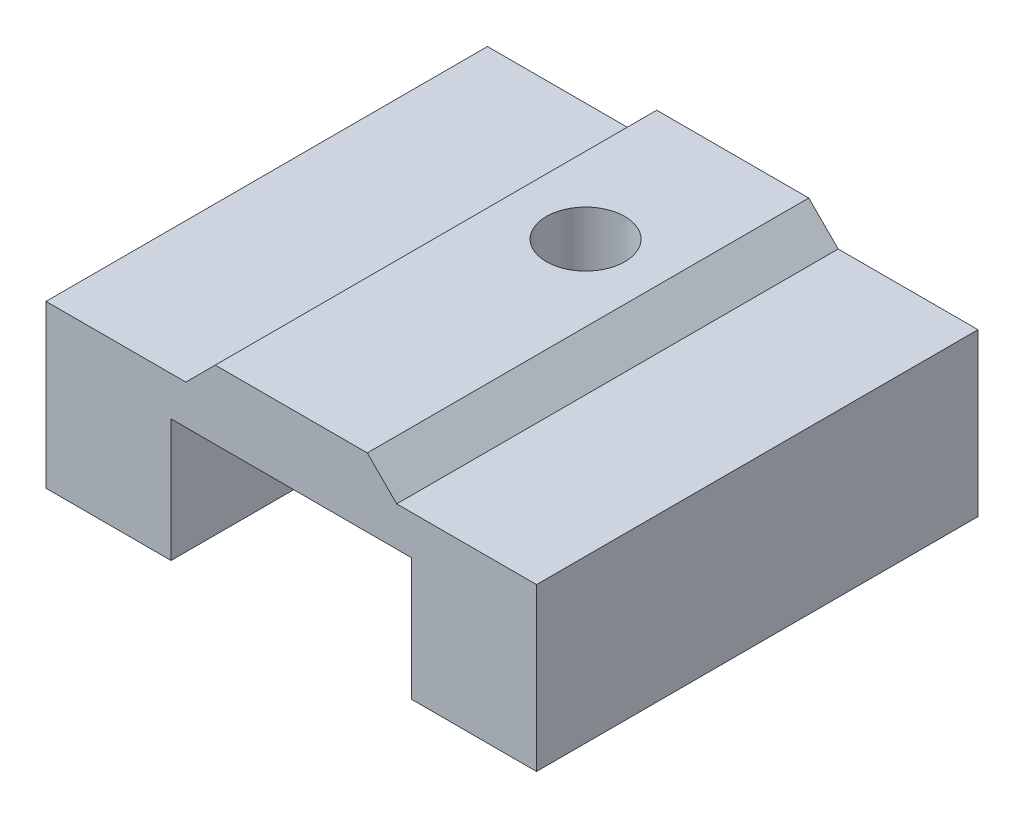
ISO-10303-21;
HEADER;
FILE_DESCRIPTION(('STEP AP214'),'2;1');
FILE_NAME('part.step','',(''),(''),'','','');
FILE_SCHEMA(('AUTOMOTIVE_DESIGN { 1 0 10303 214 1 1 1 1 }'));
ENDSEC;
DATA;
#1=APPLICATION_CONTEXT('core data for automotive mechanical design processes');
#2=APPLICATION_PROTOCOL_DEFINITION('international standard','automotive_design',2000,#1);
#3=PRODUCT_CONTEXT('',#1,'mechanical');
#4=PRODUCT('Part','Part','',(#3));
#5=PRODUCT_RELATED_PRODUCT_CATEGORY('part','',(#4));
#6=PRODUCT_DEFINITION_FORMATION('','',#4);
#7=PRODUCT_DEFINITION_CONTEXT('part definition',#1,'design');
#8=PRODUCT_DEFINITION('design','',#6,#7);
#9=PRODUCT_DEFINITION_SHAPE('','',#8);
#10=(LENGTH_UNIT() NAMED_UNIT(*) SI_UNIT(.MILLI.,.METRE.));
#11=(NAMED_UNIT(*) PLANE_ANGLE_UNIT() SI_UNIT($,.RADIAN.));
#12=(NAMED_UNIT(*) SI_UNIT($,.STERADIAN.) SOLID_ANGLE_UNIT());
#13=UNCERTAINTY_MEASURE_WITH_UNIT(LENGTH_MEASURE(1.E-05),#10,'distance_accuracy_value','');
#14=(GEOMETRIC_REPRESENTATION_CONTEXT(3) GLOBAL_UNCERTAINTY_ASSIGNED_CONTEXT((#13)) GLOBAL_UNIT_ASSIGNED_CONTEXT((#10,
#11,#12)) REPRESENTATION_CONTEXT('',''));
#15=CARTESIAN_POINT('',(0.,0.,0.));
#16=DIRECTION('',(0.,0.,1.));
#17=DIRECTION('',(1.,0.,0.));
#18=AXIS2_PLACEMENT_3D('',#15,#16,#17);
#19=CARTESIAN_POINT('',(-10.,-1.2,18.));
#20=DIRECTION('',(0.,-1.,0.));
#21=DIRECTION('',(0.,0.,-1.));
#22=AXIS2_PLACEMENT_3D('',#19,#20,#21);
#23=PLANE('',#22);
#24=DIRECTION('',(-1.,0.,0.));
#25=VECTOR('',#24,1.);
#26=CARTESIAN_POINT('',(-10.,-1.2,18.));
#27=LINE('',#26,#25);
#28=CARTESIAN_POINT('',(-4.30000000000001,-1.2,18.));
#29=VERTEX_POINT('',#28);
#30=CARTESIAN_POINT('',(-10.,-1.2,18.));
#31=VERTEX_POINT('',#30);
#32=EDGE_CURVE('E120',#29,#31,#27,.T.);
#33=ORIENTED_EDGE('',*,*,#32,.F.);
#34=DIRECTION('',(0.,0.,-1.));
#35=VECTOR('',#34,1.);
#36=CARTESIAN_POINT('',(-4.30000000000001,-1.2,0.));
#37=LINE('',#36,#35);
#38=CARTESIAN_POINT('',(-4.30000000000001,-1.2,0.));
#39=VERTEX_POINT('',#38);
#40=EDGE_CURVE('E207',#29,#39,#37,.T.);
#41=ORIENTED_EDGE('',*,*,#40,.T.);
#42=DIRECTION('',(-1.,0.,0.));
#43=VECTOR('',#42,1.);
#44=CARTESIAN_POINT('',(-10.,-1.2,0.));
#45=LINE('',#44,#43);
#46=CARTESIAN_POINT('',(-10.,-1.2,0.));
#47=VERTEX_POINT('',#46);
#48=EDGE_CURVE('E132',#39,#47,#45,.T.);
#49=ORIENTED_EDGE('',*,*,#48,.T.);
#50=DIRECTION('',(0.,0.,-1.));
#51=VECTOR('',#50,1.);
#52=CARTESIAN_POINT('',(-10.,-1.2,18.));
#53=LINE('',#52,#51);
#54=EDGE_CURVE('E130',#31,#47,#53,.T.);
#55=ORIENTED_EDGE('',*,*,#54,.F.);
#56=EDGE_LOOP('',(#33,#41,#49,#55));
#57=FACE_BOUND('',#56,.T.);
#58=ADVANCED_FACE('F35',(#57),#23,.F.);
#59=CARTESIAN_POINT('',(-10.,-7.8,18.));
#60=DIRECTION('',(1.,0.,0.));
#61=DIRECTION('',(0.,1.,0.));
#62=AXIS2_PLACEMENT_3D('',#59,#60,#61);
#63=PLANE('',#62);
#64=DIRECTION('',(0.,-1.,0.));
#65=VECTOR('',#64,1.);
#66=CARTESIAN_POINT('',(-10.,-7.8,0.));
#67=LINE('',#66,#65);
#68=CARTESIAN_POINT('',(-10.,-7.8,0.));
#69=VERTEX_POINT('',#68);
#70=EDGE_CURVE('E163',#47,#69,#67,.T.);
#71=ORIENTED_EDGE('',*,*,#70,.T.);
#72=DIRECTION('',(0.,0.,-1.));
#73=VECTOR('',#72,1.);
#74=CARTESIAN_POINT('',(-10.,-7.8,18.));
#75=LINE('',#74,#73);
#76=CARTESIAN_POINT('',(-10.,-7.8,18.));
#77=VERTEX_POINT('',#76);
#78=EDGE_CURVE('E136',#77,#69,#75,.T.);
#79=ORIENTED_EDGE('',*,*,#78,.F.);
#80=DIRECTION('',(0.,-1.,0.));
#81=VECTOR('',#80,1.);
#82=CARTESIAN_POINT('',(-10.,-7.8,18.));
#83=LINE('',#82,#81);
#84=EDGE_CURVE('E124',#31,#77,#83,.T.);
#85=ORIENTED_EDGE('',*,*,#84,.F.);
#86=ORIENTED_EDGE('',*,*,#54,.T.);
#87=EDGE_LOOP('',(#71,#79,#85,#86));
#88=FACE_BOUND('',#87,.T.);
#89=ADVANCED_FACE('F138',(#88),#63,.F.);
#90=CARTESIAN_POINT('',(-4.9,-7.8,18.));
#91=DIRECTION('',(0.,1.,0.));
#92=DIRECTION('',(0.,0.,1.));
#93=AXIS2_PLACEMENT_3D('',#90,#91,#92);
#94=PLANE('',#93);
#95=DIRECTION('',(1.,0.,0.));
#96=VECTOR('',#95,1.);
#97=CARTESIAN_POINT('',(-4.9,-7.8,0.));
#98=LINE('',#97,#96);
#99=CARTESIAN_POINT('',(-4.9,-7.8,0.));
#100=VERTEX_POINT('',#99);
#101=EDGE_CURVE('E166',#69,#100,#98,.T.);
#102=ORIENTED_EDGE('',*,*,#101,.T.);
#103=DIRECTION('',(0.,0.,-1.));
#104=VECTOR('',#103,1.);
#105=CARTESIAN_POINT('',(-4.9,-7.8,18.));
#106=LINE('',#105,#104);
#107=CARTESIAN_POINT('',(-4.9,-7.8,18.));
#108=VERTEX_POINT('',#107);
#109=EDGE_CURVE('E202',#108,#100,#106,.T.);
#110=ORIENTED_EDGE('',*,*,#109,.F.);
#111=DIRECTION('',(1.,0.,0.));
#112=VECTOR('',#111,1.);
#113=CARTESIAN_POINT('',(-4.9,-7.8,18.));
#114=LINE('',#113,#112);
#115=EDGE_CURVE('E141',#77,#108,#114,.T.);
#116=ORIENTED_EDGE('',*,*,#115,.F.);
#117=ORIENTED_EDGE('',*,*,#78,.T.);
#118=EDGE_LOOP('',(#102,#110,#116,#117));
#119=FACE_BOUND('',#118,.T.);
#120=ADVANCED_FACE('F232',(#119),#94,.F.);
#121=CARTESIAN_POINT('',(-4.9,-2.8,18.));
#122=DIRECTION('',(-1.,0.,0.));
#123=DIRECTION('',(0.,0.,1.));
#124=AXIS2_PLACEMENT_3D('',#121,#122,#123);
#125=PLANE('',#124);
#126=DIRECTION('',(0.,1.,0.));
#127=VECTOR('',#126,1.);
#128=CARTESIAN_POINT('',(-4.9,-2.8,0.));
#129=LINE('',#128,#127);
#130=CARTESIAN_POINT('',(-4.9,-2.8,0.));
#131=VERTEX_POINT('',#130);
#132=EDGE_CURVE('E168',#100,#131,#129,.T.);
#133=ORIENTED_EDGE('',*,*,#132,.T.);
#134=DIRECTION('',(0.,0.,-1.));
#135=VECTOR('',#134,1.);
#136=CARTESIAN_POINT('',(-4.9,-2.8,18.));
#137=LINE('',#136,#135);
#138=CARTESIAN_POINT('',(-4.9,-2.8,18.));
#139=VERTEX_POINT('',#138);
#140=EDGE_CURVE('E199',#139,#131,#137,.T.);
#141=ORIENTED_EDGE('',*,*,#140,.F.);
#142=DIRECTION('',(0.,1.,0.));
#143=VECTOR('',#142,1.);
#144=CARTESIAN_POINT('',(-4.9,-2.8,18.));
#145=LINE('',#144,#143);
#146=EDGE_CURVE('E143',#108,#139,#145,.T.);
#147=ORIENTED_EDGE('',*,*,#146,.F.);
#148=ORIENTED_EDGE('',*,*,#109,.T.);
#149=EDGE_LOOP('',(#133,#141,#147,#148));
#150=FACE_BOUND('',#149,.T.);
#151=ADVANCED_FACE('F242',(#150),#125,.F.);
#152=CARTESIAN_POINT('',(4.9,-2.8,18.));
#153=DIRECTION('',(0.,1.,0.));
#154=DIRECTION('',(0.,0.,1.));
#155=AXIS2_PLACEMENT_3D('',#152,#153,#154);
#156=PLANE('',#155);
#157=CARTESIAN_POINT('',(0.,-2.8,6.));
#158=DIRECTION('',(0.,1.,0.));
#159=DIRECTION('',(0.,0.,1.));
#160=AXIS2_PLACEMENT_3D('',#157,#158,#159);
#161=CIRCLE('',#160,1.6);
#162=CARTESIAN_POINT('',(0.,-2.8,7.6));
#163=VERTEX_POINT('',#162);
#164=EDGE_CURVE('E164',#163,#163,#161,.T.);
#165=ORIENTED_EDGE('',*,*,#164,.T.);
#166=EDGE_LOOP('',(#165));
#167=FACE_BOUND('',#166,.T.);
#168=DIRECTION('',(1.,0.,0.));
#169=VECTOR('',#168,1.);
#170=CARTESIAN_POINT('',(4.9,-2.8,0.));
#171=LINE('',#170,#169);
#172=CARTESIAN_POINT('',(4.9,-2.8,0.));
#173=VERTEX_POINT('',#172);
#174=EDGE_CURVE('E170',#131,#173,#171,.T.);
#175=ORIENTED_EDGE('',*,*,#174,.T.);
#176=DIRECTION('',(0.,0.,-1.));
#177=VECTOR('',#176,1.);
#178=CARTESIAN_POINT('',(4.9,-2.8,18.));
#179=LINE('',#178,#177);
#180=CARTESIAN_POINT('',(4.9,-2.8,18.));
#181=VERTEX_POINT('',#180);
#182=EDGE_CURVE('E196',#181,#173,#179,.T.);
#183=ORIENTED_EDGE('',*,*,#182,.F.);
#184=DIRECTION('',(1.,0.,0.));
#185=VECTOR('',#184,1.);
#186=CARTESIAN_POINT('',(4.9,-2.8,18.));
#187=LINE('',#186,#185);
#188=EDGE_CURVE('E148',#139,#181,#187,.T.);
#189=ORIENTED_EDGE('',*,*,#188,.F.);
#190=ORIENTED_EDGE('',*,*,#140,.T.);
#191=EDGE_LOOP('',(#175,#183,#189,#190));
#192=FACE_BOUND('',#191,.T.);
#193=ADVANCED_FACE('F246',(#167,#192),#156,.F.);
#194=CARTESIAN_POINT('',(4.9,-7.8,18.));
#195=DIRECTION('',(1.,0.,0.));
#196=DIRECTION('',(0.,0.,-1.));
#197=AXIS2_PLACEMENT_3D('',#194,#195,#196);
#198=PLANE('',#197);
#199=DIRECTION('',(0.,-1.,0.));
#200=VECTOR('',#199,1.);
#201=CARTESIAN_POINT('',(4.9,-7.8,0.));
#202=LINE('',#201,#200);
#203=CARTESIAN_POINT('',(4.9,-7.8,0.));
#204=VERTEX_POINT('',#203);
#205=EDGE_CURVE('E172',#173,#204,#202,.T.);
#206=ORIENTED_EDGE('',*,*,#205,.T.);
#207=DIRECTION('',(0.,0.,-1.));
#208=VECTOR('',#207,1.);
#209=CARTESIAN_POINT('',(4.9,-7.8,18.));
#210=LINE('',#209,#208);
#211=CARTESIAN_POINT('',(4.9,-7.8,18.));
#212=VERTEX_POINT('',#211);
#213=EDGE_CURVE('E193',#212,#204,#210,.T.);
#214=ORIENTED_EDGE('',*,*,#213,.F.);
#215=DIRECTION('',(0.,-1.,0.));
#216=VECTOR('',#215,1.);
#217=CARTESIAN_POINT('',(4.9,-7.8,18.));
#218=LINE('',#217,#216);
#219=EDGE_CURVE('E150',#181,#212,#218,.T.);
#220=ORIENTED_EDGE('',*,*,#219,.F.);
#221=ORIENTED_EDGE('',*,*,#182,.T.);
#222=EDGE_LOOP('',(#206,#214,#220,#221));
#223=FACE_BOUND('',#222,.T.);
#224=ADVANCED_FACE('F250',(#223),#198,.F.);
#225=CARTESIAN_POINT('',(10.,-7.8,18.));
#226=DIRECTION('',(0.,1.,0.));
#227=DIRECTION('',(0.,0.,1.));
#228=AXIS2_PLACEMENT_3D('',#225,#226,#227);
#229=PLANE('',#228);
#230=DIRECTION('',(1.,0.,0.));
#231=VECTOR('',#230,1.);
#232=CARTESIAN_POINT('',(10.,-7.8,0.));
#233=LINE('',#232,#231);
#234=CARTESIAN_POINT('',(10.,-7.8,0.));
#235=VERTEX_POINT('',#234);
#236=EDGE_CURVE('E174',#204,#235,#233,.T.);
#237=ORIENTED_EDGE('',*,*,#236,.T.);
#238=DIRECTION('',(0.,0.,-1.));
#239=VECTOR('',#238,1.);
#240=CARTESIAN_POINT('',(10.,-7.8,18.));
#241=LINE('',#240,#239);
#242=CARTESIAN_POINT('',(10.,-7.8,18.));
#243=VERTEX_POINT('',#242);
#244=EDGE_CURVE('E190',#243,#235,#241,.T.);
#245=ORIENTED_EDGE('',*,*,#244,.F.);
#246=DIRECTION('',(1.,0.,0.));
#247=VECTOR('',#246,1.);
#248=CARTESIAN_POINT('',(10.,-7.8,18.));
#249=LINE('',#248,#247);
#250=EDGE_CURVE('E152',#212,#243,#249,.T.);
#251=ORIENTED_EDGE('',*,*,#250,.F.);
#252=ORIENTED_EDGE('',*,*,#213,.T.);
#253=EDGE_LOOP('',(#237,#245,#251,#252));
#254=FACE_BOUND('',#253,.T.);
#255=ADVANCED_FACE('F254',(#254),#229,.F.);
#256=CARTESIAN_POINT('',(10.,-1.2,18.));
#257=DIRECTION('',(-1.,0.,0.));
#258=DIRECTION('',(0.,-1.,0.));
#259=AXIS2_PLACEMENT_3D('',#256,#257,#258);
#260=PLANE('',#259);
#261=DIRECTION('',(0.,1.,0.));
#262=VECTOR('',#261,1.);
#263=CARTESIAN_POINT('',(10.,-1.2,0.));
#264=LINE('',#263,#262);
#265=CARTESIAN_POINT('',(10.,-1.2,0.));
#266=VERTEX_POINT('',#265);
#267=EDGE_CURVE('E176',#235,#266,#264,.T.);
#268=ORIENTED_EDGE('',*,*,#267,.T.);
#269=DIRECTION('',(0.,0.,-1.));
#270=VECTOR('',#269,1.);
#271=CARTESIAN_POINT('',(10.,-1.2,18.));
#272=LINE('',#271,#270);
#273=CARTESIAN_POINT('',(10.,-1.2,18.));
#274=VERTEX_POINT('',#273);
#275=EDGE_CURVE('E187',#274,#266,#272,.T.);
#276=ORIENTED_EDGE('',*,*,#275,.F.);
#277=DIRECTION('',(0.,1.,0.));
#278=VECTOR('',#277,1.);
#279=CARTESIAN_POINT('',(10.,-1.2,18.));
#280=LINE('',#279,#278);
#281=EDGE_CURVE('E154',#243,#274,#280,.T.);
#282=ORIENTED_EDGE('',*,*,#281,.F.);
#283=ORIENTED_EDGE('',*,*,#244,.T.);
#284=EDGE_LOOP('',(#268,#276,#282,#283));
#285=FACE_BOUND('',#284,.T.);
#286=ADVANCED_FACE('F258',(#285),#260,.F.);
#287=CARTESIAN_POINT('',(3.1,-1.2,18.));
#288=DIRECTION('',(0.,-1.,0.));
#289=DIRECTION('',(0.,0.,-1.));
#290=AXIS2_PLACEMENT_3D('',#287,#288,#289);
#291=PLANE('',#290);
#292=DIRECTION('',(-1.,0.,0.));
#293=VECTOR('',#292,1.);
#294=CARTESIAN_POINT('',(3.1,-1.2,0.));
#295=LINE('',#294,#293);
#296=CARTESIAN_POINT('',(4.3,-1.2,0.));
#297=VERTEX_POINT('',#296);
#298=EDGE_CURVE('E178',#266,#297,#295,.T.);
#299=ORIENTED_EDGE('',*,*,#298,.T.);
#300=DIRECTION('',(0.,0.,1.));
#301=VECTOR('',#300,1.);
#302=CARTESIAN_POINT('',(4.3,-1.2,18.));
#303=LINE('',#302,#301);
#304=CARTESIAN_POINT('',(4.3,-1.2,18.));
#305=VERTEX_POINT('',#304);
#306=EDGE_CURVE('E135',#297,#305,#303,.T.);
#307=ORIENTED_EDGE('',*,*,#306,.T.);
#308=DIRECTION('',(-1.,0.,0.));
#309=VECTOR('',#308,1.);
#310=CARTESIAN_POINT('',(3.1,-1.2,18.));
#311=LINE('',#310,#309);
#312=EDGE_CURVE('E156',#274,#305,#311,.T.);
#313=ORIENTED_EDGE('',*,*,#312,.F.);
#314=ORIENTED_EDGE('',*,*,#275,.T.);
#315=EDGE_LOOP('',(#299,#307,#313,#314));
#316=FACE_BOUND('',#315,.T.);
#317=ADVANCED_FACE('F262',(#316),#291,.F.);
#318=CARTESIAN_POINT('',(-3.1,0.,18.));
#319=DIRECTION('',(0.,-1.,0.));
#320=DIRECTION('',(0.,0.,-1.));
#321=AXIS2_PLACEMENT_3D('',#318,#319,#320);
#322=PLANE('',#321);
#323=CARTESIAN_POINT('',(0.,0.,6.));
#324=DIRECTION('',(0.,1.,0.));
#325=DIRECTION('',(0.,0.,1.));
#326=AXIS2_PLACEMENT_3D('',#323,#324,#325);
#327=CIRCLE('',#326,1.6);
#328=CARTESIAN_POINT('',(0.,0.,7.6));
#329=VERTEX_POINT('',#328);
#330=EDGE_CURVE('E281',#329,#329,#327,.T.);
#331=ORIENTED_EDGE('',*,*,#330,.F.);
#332=EDGE_LOOP('',(#331));
#333=FACE_BOUND('',#332,.T.);
#334=DIRECTION('',(-1.,0.,0.));
#335=VECTOR('',#334,1.);
#336=CARTESIAN_POINT('',(-3.1,0.,0.));
#337=LINE('',#336,#335);
#338=CARTESIAN_POINT('',(3.1,0.,0.));
#339=VERTEX_POINT('',#338);
#340=CARTESIAN_POINT('',(-3.1,0.,0.));
#341=VERTEX_POINT('',#340);
#342=EDGE_CURVE('E127',#339,#341,#337,.T.);
#343=ORIENTED_EDGE('',*,*,#342,.T.);
#344=DIRECTION('',(0.,0.,-1.));
#345=VECTOR('',#344,1.);
#346=CARTESIAN_POINT('',(-3.1,0.,18.));
#347=LINE('',#346,#345);
#348=CARTESIAN_POINT('',(-3.1,0.,18.));
#349=VERTEX_POINT('',#348);
#350=EDGE_CURVE('E161',#349,#341,#347,.T.);
#351=ORIENTED_EDGE('',*,*,#350,.F.);
#352=DIRECTION('',(-1.,0.,0.));
#353=VECTOR('',#352,1.);
#354=CARTESIAN_POINT('',(-3.1,0.,18.));
#355=LINE('',#354,#353);
#356=CARTESIAN_POINT('',(3.1,0.,18.));
#357=VERTEX_POINT('',#356);
#358=EDGE_CURVE('E159',#357,#349,#355,.T.);
#359=ORIENTED_EDGE('',*,*,#358,.F.);
#360=DIRECTION('',(0.,0.,-1.));
#361=VECTOR('',#360,1.);
#362=CARTESIAN_POINT('',(3.1,0.,18.));
#363=LINE('',#362,#361);
#364=EDGE_CURVE('E184',#357,#339,#363,.T.);
#365=ORIENTED_EDGE('',*,*,#364,.T.);
#366=EDGE_LOOP('',(#343,#351,#359,#365));
#367=FACE_BOUND('',#366,.T.);
#368=ADVANCED_FACE('F217',(#333,#367),#322,.F.);
#369=CARTESIAN_POINT('',(0.,0.,18.));
#370=DIRECTION('',(0.,0.,-1.));
#371=DIRECTION('',(-1.,0.,0.));
#372=AXIS2_PLACEMENT_3D('',#369,#370,#371);
#373=PLANE('',#372);
#374=ORIENTED_EDGE('',*,*,#358,.T.);
#375=DIRECTION('',(0.707106781186552,0.707106781186543,0.));
#376=VECTOR('',#375,1.);
#377=CARTESIAN_POINT('',(-1.54999999999998,1.55,18.));
#378=LINE('',#377,#376);
#379=EDGE_CURVE('E11',#349,#29,#378,.F.);
#380=ORIENTED_EDGE('',*,*,#379,.T.);
#381=ORIENTED_EDGE('',*,*,#32,.T.);
#382=ORIENTED_EDGE('',*,*,#84,.T.);
#383=ORIENTED_EDGE('',*,*,#115,.T.);
#384=ORIENTED_EDGE('',*,*,#146,.T.);
#385=ORIENTED_EDGE('',*,*,#188,.T.);
#386=ORIENTED_EDGE('',*,*,#219,.T.);
#387=ORIENTED_EDGE('',*,*,#250,.T.);
#388=ORIENTED_EDGE('',*,*,#281,.T.);
#389=ORIENTED_EDGE('',*,*,#312,.T.);
#390=DIRECTION('',(0.707106781186547,-0.707106781186548,0.));
#391=VECTOR('',#390,1.);
#392=CARTESIAN_POINT('',(1.55,1.55,18.));
#393=LINE('',#392,#391);
#394=EDGE_CURVE('E211',#305,#357,#393,.F.);
#395=ORIENTED_EDGE('',*,*,#394,.T.);
#396=EDGE_LOOP('',(#374,#380,#381,#382,#383,#384,#385,#386,#387,#388,#389,#395));
#397=FACE_BOUND('',#396,.T.);
#398=ADVANCED_FACE('F122',(#397),#373,.F.);
#399=CARTESIAN_POINT('',(0.,0.,0.));
#400=DIRECTION('',(0.,0.,-1.));
#401=DIRECTION('',(-1.,0.,0.));
#402=AXIS2_PLACEMENT_3D('',#399,#400,#401);
#403=PLANE('',#402);
#404=ORIENTED_EDGE('',*,*,#48,.F.);
#405=DIRECTION('',(-0.707106781186552,-0.707106781186543,0.));
#406=VECTOR('',#405,1.);
#407=CARTESIAN_POINT('',(-4.30000000000001,-1.2,0.));
#408=LINE('',#407,#406);
#409=EDGE_CURVE('E44',#39,#341,#408,.F.);
#410=ORIENTED_EDGE('',*,*,#409,.T.);
#411=ORIENTED_EDGE('',*,*,#342,.F.);
#412=DIRECTION('',(-0.707106781186547,0.707106781186548,0.));
#413=VECTOR('',#412,1.);
#414=CARTESIAN_POINT('',(3.1,0.,0.));
#415=LINE('',#414,#413);
#416=EDGE_CURVE('E209',#339,#297,#415,.F.);
#417=ORIENTED_EDGE('',*,*,#416,.T.);
#418=ORIENTED_EDGE('',*,*,#298,.F.);
#419=ORIENTED_EDGE('',*,*,#267,.F.);
#420=ORIENTED_EDGE('',*,*,#236,.F.);
#421=ORIENTED_EDGE('',*,*,#205,.F.);
#422=ORIENTED_EDGE('',*,*,#174,.F.);
#423=ORIENTED_EDGE('',*,*,#132,.F.);
#424=ORIENTED_EDGE('',*,*,#101,.F.);
#425=ORIENTED_EDGE('',*,*,#70,.F.);
#426=EDGE_LOOP('',(#404,#410,#411,#417,#418,#419,#420,#421,#422,#423,#424,#425));
#427=FACE_BOUND('',#426,.T.);
#428=ADVANCED_FACE('F214',(#427),#403,.T.);
#429=CARTESIAN_POINT('',(0.,-24.,6.));
#430=DIRECTION('',(0.,1.,0.));
#431=DIRECTION('',(0.,0.,1.));
#432=AXIS2_PLACEMENT_3D('',#429,#430,#431);
#433=CYLINDRICAL_SURFACE('',#432,1.6);
#434=ORIENTED_EDGE('',*,*,#330,.T.);
#435=EDGE_LOOP('',(#434));
#436=FACE_BOUND('',#435,.T.);
#437=ORIENTED_EDGE('',*,*,#164,.F.);
#438=EDGE_LOOP('',(#437));
#439=FACE_BOUND('',#438,.T.);
#440=ADVANCED_FACE('F225',(#436,#439),#433,.F.);
#441=CARTESIAN_POINT('',(3.1,0.,18.));
#442=DIRECTION('',(0.707106781186548,0.707106781186547,0.));
#443=DIRECTION('',(0.,0.,1.));
#444=AXIS2_PLACEMENT_3D('',#441,#442,#443);
#445=PLANE('',#444);
#446=ORIENTED_EDGE('',*,*,#394,.F.);
#447=ORIENTED_EDGE('',*,*,#306,.F.);
#448=ORIENTED_EDGE('',*,*,#416,.F.);
#449=ORIENTED_EDGE('',*,*,#364,.F.);
#450=EDGE_LOOP('',(#446,#447,#448,#449));
#451=FACE_BOUND('',#450,.T.);
#452=ADVANCED_FACE('F221',(#451),#445,.T.);
#453=CARTESIAN_POINT('',(-4.30000000000001,-1.2,18.));
#454=DIRECTION('',(-0.707106781186543,0.707106781186552,0.));
#455=DIRECTION('',(0.,0.,1.));
#456=AXIS2_PLACEMENT_3D('',#453,#454,#455);
#457=PLANE('',#456);
#458=ORIENTED_EDGE('',*,*,#379,.F.);
#459=ORIENTED_EDGE('',*,*,#350,.T.);
#460=ORIENTED_EDGE('',*,*,#409,.F.);
#461=ORIENTED_EDGE('',*,*,#40,.F.);
#462=EDGE_LOOP('',(#458,#459,#460,#461));
#463=FACE_BOUND('',#462,.T.);
#464=ADVANCED_FACE('F38',(#463),#457,.T.);
#465=CLOSED_SHELL('',(#58,#89,#120,#151,#193,#224,#255,#286,#317,#368,#398,#428,#440,#452,#464));
#466=MANIFOLD_SOLID_BREP('B2',#465);
#467=ADVANCED_BREP_SHAPE_REPRESENTATION('',(#18,#466),#14);
#468=SHAPE_DEFINITION_REPRESENTATION(#9,#467);
ENDSEC;
END-ISO-10303-21;
